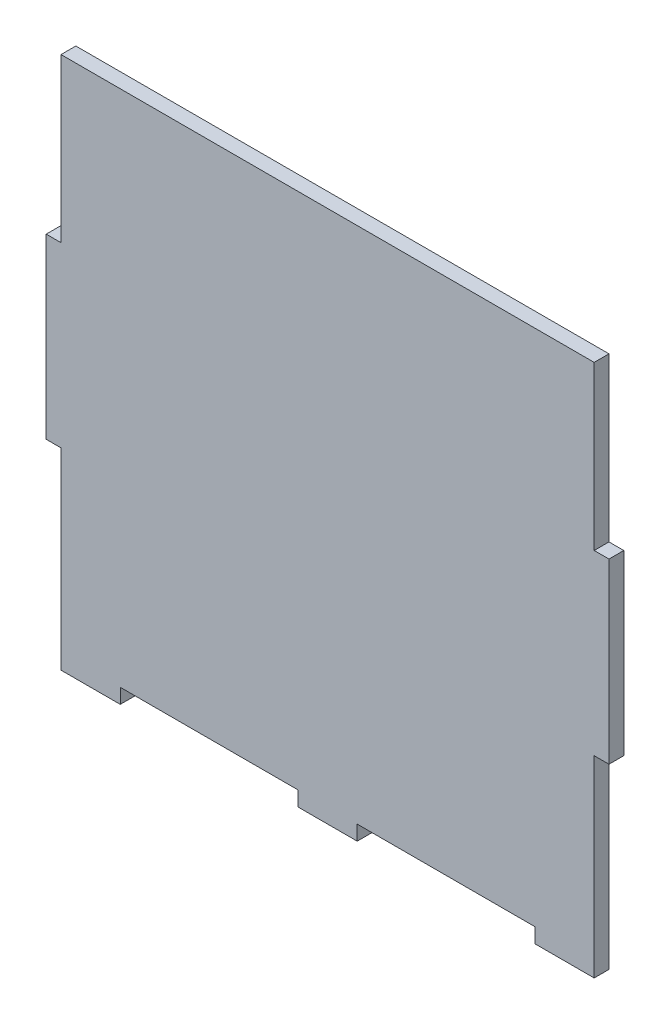
ISO-10303-21;
HEADER;
FILE_DESCRIPTION(('STEP AP214'),'2;1');
FILE_NAME('part.step','',(''),(''),'','','');
FILE_SCHEMA(('AUTOMOTIVE_DESIGN { 1 0 10303 214 1 1 1 1 }'));
ENDSEC;
DATA;
#1=APPLICATION_CONTEXT('core data for automotive mechanical design processes');
#2=APPLICATION_PROTOCOL_DEFINITION('international standard','automotive_design',2000,#1);
#3=PRODUCT_CONTEXT('',#1,'mechanical');
#4=PRODUCT('Part','Part','',(#3));
#5=PRODUCT_RELATED_PRODUCT_CATEGORY('part','',(#4));
#6=PRODUCT_DEFINITION_FORMATION('','',#4);
#7=PRODUCT_DEFINITION_CONTEXT('part definition',#1,'design');
#8=PRODUCT_DEFINITION('design','',#6,#7);
#9=PRODUCT_DEFINITION_SHAPE('','',#8);
#10=(LENGTH_UNIT() NAMED_UNIT(*) SI_UNIT(.MILLI.,.METRE.));
#11=(NAMED_UNIT(*) PLANE_ANGLE_UNIT() SI_UNIT($,.RADIAN.));
#12=(NAMED_UNIT(*) SI_UNIT($,.STERADIAN.) SOLID_ANGLE_UNIT());
#13=UNCERTAINTY_MEASURE_WITH_UNIT(LENGTH_MEASURE(1.E-05),#10,'distance_accuracy_value','');
#14=(GEOMETRIC_REPRESENTATION_CONTEXT(3) GLOBAL_UNCERTAINTY_ASSIGNED_CONTEXT((#13)) GLOBAL_UNIT_ASSIGNED_CONTEXT((#10,
#11,#12)) REPRESENTATION_CONTEXT('',''));
#15=CARTESIAN_POINT('',(0.,0.,0.));
#16=DIRECTION('',(0.,0.,1.));
#17=DIRECTION('',(1.,0.,0.));
#18=AXIS2_PLACEMENT_3D('',#15,#16,#17);
#19=CARTESIAN_POINT('',(-2.52340689555522E-13,-48.6157683545223,6.35));
#20=DIRECTION('',(0.,-1.,0.));
#21=DIRECTION('',(1.,0.,0.));
#22=AXIS2_PLACEMENT_3D('',#19,#20,#21);
#23=PLANE('',#22);
#24=DIRECTION('',(-1.,0.,0.));
#25=VECTOR('',#24,1.);
#26=CARTESIAN_POINT('',(-2.52340689555522E-13,-48.6157683545223,0.));
#27=LINE('',#26,#25);
#28=CARTESIAN_POINT('',(119.54433308199,-48.615768354523,0.));
#29=VERTEX_POINT('',#28);
#30=CARTESIAN_POINT('',(94.1443330819899,-48.6157683545228,0.));
#31=VERTEX_POINT('',#30);
#32=EDGE_CURVE('E201',#29,#31,#27,.T.);
#33=ORIENTED_EDGE('',*,*,#32,.F.);
#34=DIRECTION('',(0.,0.,-1.));
#35=VECTOR('',#34,1.);
#36=CARTESIAN_POINT('',(119.54433308199,-48.615768354523,6.35));
#37=LINE('',#36,#35);
#38=CARTESIAN_POINT('',(119.54433308199,-48.615768354523,6.35));
#39=VERTEX_POINT('',#38);
#40=EDGE_CURVE('E11',#39,#29,#37,.T.);
#41=ORIENTED_EDGE('',*,*,#40,.F.);
#42=DIRECTION('',(-1.,0.,0.));
#43=VECTOR('',#42,1.);
#44=CARTESIAN_POINT('',(-2.52340689555522E-13,-48.6157683545223,6.35));
#45=LINE('',#44,#43);
#46=CARTESIAN_POINT('',(94.1443330819899,-48.6157683545228,6.35));
#47=VERTEX_POINT('',#46);
#48=EDGE_CURVE('E248',#39,#47,#45,.T.);
#49=ORIENTED_EDGE('',*,*,#48,.T.);
#50=DIRECTION('',(0.,0.,-1.));
#51=VECTOR('',#50,1.);
#52=CARTESIAN_POINT('',(94.1443330819899,-48.6157683545228,6.35));
#53=LINE('',#52,#51);
#54=EDGE_CURVE('E51',#47,#31,#53,.T.);
#55=ORIENTED_EDGE('',*,*,#54,.T.);
#56=EDGE_LOOP('',(#33,#41,#49,#55));
#57=FACE_BOUND('',#56,.T.);
#58=ADVANCED_FACE('F35',(#57),#23,.T.);
#59=CARTESIAN_POINT('',(119.54433308199,0.,6.35));
#60=DIRECTION('',(1.,0.,0.));
#61=DIRECTION('',(0.,0.,-1.));
#62=AXIS2_PLACEMENT_3D('',#59,#60,#61);
#63=PLANE('',#62);
#64=DIRECTION('',(0.,-1.,0.));
#65=VECTOR('',#64,1.);
#66=CARTESIAN_POINT('',(119.54433308199,0.,0.));
#67=LINE('',#66,#65);
#68=CARTESIAN_POINT('',(119.54433308199,33.934231645477,0.));
#69=VERTEX_POINT('',#68);
#70=EDGE_CURVE('E203',#69,#29,#67,.T.);
#71=ORIENTED_EDGE('',*,*,#70,.F.);
#72=DIRECTION('',(0.,0.,-1.));
#73=VECTOR('',#72,1.);
#74=CARTESIAN_POINT('',(119.54433308199,33.934231645477,6.35));
#75=LINE('',#74,#73);
#76=CARTESIAN_POINT('',(119.54433308199,33.934231645477,6.35));
#77=VERTEX_POINT('',#76);
#78=EDGE_CURVE('E43',#77,#69,#75,.T.);
#79=ORIENTED_EDGE('',*,*,#78,.F.);
#80=DIRECTION('',(0.,-1.,0.));
#81=VECTOR('',#80,1.);
#82=CARTESIAN_POINT('',(119.54433308199,0.,6.35));
#83=LINE('',#82,#81);
#84=EDGE_CURVE('E306',#77,#39,#83,.T.);
#85=ORIENTED_EDGE('',*,*,#84,.T.);
#86=ORIENTED_EDGE('',*,*,#40,.T.);
#87=EDGE_LOOP('',(#71,#79,#85,#86));
#88=FACE_BOUND('',#87,.T.);
#89=ADVANCED_FACE('F294',(#88),#63,.T.);
#90=CARTESIAN_POINT('',(0.,33.934231645477,6.35));
#91=DIRECTION('',(0.,-1.,0.));
#92=DIRECTION('',(0.,0.,-1.));
#93=AXIS2_PLACEMENT_3D('',#90,#91,#92);
#94=PLANE('',#93);
#95=DIRECTION('',(-1.,0.,0.));
#96=VECTOR('',#95,1.);
#97=CARTESIAN_POINT('',(0.,33.934231645477,0.));
#98=LINE('',#97,#96);
#99=CARTESIAN_POINT('',(125.89433308199,33.934231645477,0.));
#100=VERTEX_POINT('',#99);
#101=EDGE_CURVE('E206',#100,#69,#98,.T.);
#102=ORIENTED_EDGE('',*,*,#101,.F.);
#103=DIRECTION('',(0.,0.,-1.));
#104=VECTOR('',#103,1.);
#105=CARTESIAN_POINT('',(125.89433308199,33.934231645477,6.35));
#106=LINE('',#105,#104);
#107=CARTESIAN_POINT('',(125.89433308199,33.934231645477,6.35));
#108=VERTEX_POINT('',#107);
#109=EDGE_CURVE('E283',#108,#100,#106,.T.);
#110=ORIENTED_EDGE('',*,*,#109,.F.);
#111=DIRECTION('',(-1.,0.,0.));
#112=VECTOR('',#111,1.);
#113=CARTESIAN_POINT('',(0.,33.934231645477,6.35));
#114=LINE('',#113,#112);
#115=EDGE_CURVE('E290',#108,#77,#114,.T.);
#116=ORIENTED_EDGE('',*,*,#115,.T.);
#117=ORIENTED_EDGE('',*,*,#78,.T.);
#118=EDGE_LOOP('',(#102,#110,#116,#117));
#119=FACE_BOUND('',#118,.T.);
#120=ADVANCED_FACE('F288',(#119),#94,.T.);
#121=CARTESIAN_POINT('',(125.89433308199,0.,6.35));
#122=DIRECTION('',(1.,0.,0.));
#123=DIRECTION('',(0.,0.,-1.));
#124=AXIS2_PLACEMENT_3D('',#121,#122,#123);
#125=PLANE('',#124);
#126=DIRECTION('',(0.,-1.,0.));
#127=VECTOR('',#126,1.);
#128=CARTESIAN_POINT('',(125.89433308199,0.,0.));
#129=LINE('',#128,#127);
#130=CARTESIAN_POINT('',(125.89433308199,110.134231645477,0.));
#131=VERTEX_POINT('',#130);
#132=EDGE_CURVE('E210',#131,#100,#129,.T.);
#133=ORIENTED_EDGE('',*,*,#132,.F.);
#134=DIRECTION('',(0.,0.,-1.));
#135=VECTOR('',#134,1.);
#136=CARTESIAN_POINT('',(125.89433308199,110.134231645477,6.35));
#137=LINE('',#136,#135);
#138=CARTESIAN_POINT('',(125.89433308199,110.134231645477,6.35));
#139=VERTEX_POINT('',#138);
#140=EDGE_CURVE('E281',#139,#131,#137,.T.);
#141=ORIENTED_EDGE('',*,*,#140,.F.);
#142=DIRECTION('',(0.,-1.,0.));
#143=VECTOR('',#142,1.);
#144=CARTESIAN_POINT('',(125.89433308199,0.,6.35));
#145=LINE('',#144,#143);
#146=EDGE_CURVE('E305',#139,#108,#145,.T.);
#147=ORIENTED_EDGE('',*,*,#146,.T.);
#148=ORIENTED_EDGE('',*,*,#109,.T.);
#149=EDGE_LOOP('',(#133,#141,#147,#148));
#150=FACE_BOUND('',#149,.T.);
#151=ADVANCED_FACE('F301',(#150),#125,.T.);
#152=CARTESIAN_POINT('',(-2.40695983803563E-13,110.134231645477,6.35));
#153=DIRECTION('',(0.,-1.,0.));
#154=DIRECTION('',(1.,0.,0.));
#155=AXIS2_PLACEMENT_3D('',#152,#153,#154);
#156=PLANE('',#155);
#157=DIRECTION('',(-1.,0.,0.));
#158=VECTOR('',#157,1.);
#159=CARTESIAN_POINT('',(-2.40695983803563E-13,110.134231645477,0.));
#160=LINE('',#159,#158);
#161=CARTESIAN_POINT('',(119.54433308199,110.134231645477,0.));
#162=VERTEX_POINT('',#161);
#163=EDGE_CURVE('E213',#131,#162,#160,.T.);
#164=ORIENTED_EDGE('',*,*,#163,.T.);
#165=DIRECTION('',(0.,0.,-1.));
#166=VECTOR('',#165,1.);
#167=CARTESIAN_POINT('',(119.54433308199,110.134231645477,6.35));
#168=LINE('',#167,#166);
#169=CARTESIAN_POINT('',(119.54433308199,110.134231645477,6.35));
#170=VERTEX_POINT('',#169);
#171=EDGE_CURVE('E279',#170,#162,#168,.T.);
#172=ORIENTED_EDGE('',*,*,#171,.F.);
#173=DIRECTION('',(-1.,0.,0.));
#174=VECTOR('',#173,1.);
#175=CARTESIAN_POINT('',(-2.40695983803563E-13,110.134231645477,6.35));
#176=LINE('',#175,#174);
#177=EDGE_CURVE('E308',#139,#170,#176,.T.);
#178=ORIENTED_EDGE('',*,*,#177,.F.);
#179=ORIENTED_EDGE('',*,*,#140,.T.);
#180=EDGE_LOOP('',(#164,#172,#178,#179));
#181=FACE_BOUND('',#180,.T.);
#182=ADVANCED_FACE('F507',(#181),#156,.F.);
#183=CARTESIAN_POINT('',(119.54433308199,179.984231645477,0.));
#184=VERTEX_POINT('',#183);
#185=EDGE_CURVE('E207',#184,#162,#67,.T.);
#186=ORIENTED_EDGE('',*,*,#185,.F.);
#187=DIRECTION('',(0.,0.,-1.));
#188=VECTOR('',#187,1.);
#189=CARTESIAN_POINT('',(119.54433308199,179.984231645477,6.35));
#190=LINE('',#189,#188);
#191=CARTESIAN_POINT('',(119.54433308199,179.984231645477,6.35));
#192=VERTEX_POINT('',#191);
#193=EDGE_CURVE('E277',#192,#184,#190,.T.);
#194=ORIENTED_EDGE('',*,*,#193,.F.);
#195=EDGE_CURVE('E311',#192,#170,#83,.T.);
#196=ORIENTED_EDGE('',*,*,#195,.T.);
#197=ORIENTED_EDGE('',*,*,#171,.T.);
#198=EDGE_LOOP('',(#186,#194,#196,#197));
#199=FACE_BOUND('',#198,.T.);
#200=ADVANCED_FACE('F363',(#199),#63,.T.);
#201=CARTESIAN_POINT('',(0.,179.984231645477,6.35));
#202=DIRECTION('',(0.,1.,0.));
#203=DIRECTION('',(0.,0.,1.));
#204=AXIS2_PLACEMENT_3D('',#201,#202,#203);
#205=PLANE('',#204);
#206=DIRECTION('',(1.,0.,0.));
#207=VECTOR('',#206,1.);
#208=CARTESIAN_POINT('',(0.,179.984231645477,0.));
#209=LINE('',#208,#207);
#210=CARTESIAN_POINT('',(-109.05566691801,179.984231645477,0.));
#211=VERTEX_POINT('',#210);
#212=EDGE_CURVE('E216',#211,#184,#209,.T.);
#213=ORIENTED_EDGE('',*,*,#212,.F.);
#214=DIRECTION('',(0.,0.,-1.));
#215=VECTOR('',#214,1.);
#216=CARTESIAN_POINT('',(-109.05566691801,179.984231645477,6.35));
#217=LINE('',#216,#215);
#218=CARTESIAN_POINT('',(-109.05566691801,179.984231645477,6.35));
#219=VERTEX_POINT('',#218);
#220=EDGE_CURVE('E275',#219,#211,#217,.T.);
#221=ORIENTED_EDGE('',*,*,#220,.F.);
#222=DIRECTION('',(1.,0.,0.));
#223=VECTOR('',#222,1.);
#224=CARTESIAN_POINT('',(0.,179.984231645477,6.35));
#225=LINE('',#224,#223);
#226=EDGE_CURVE('E315',#219,#192,#225,.T.);
#227=ORIENTED_EDGE('',*,*,#226,.T.);
#228=ORIENTED_EDGE('',*,*,#193,.T.);
#229=EDGE_LOOP('',(#213,#221,#227,#228));
#230=FACE_BOUND('',#229,.T.);
#231=ADVANCED_FACE('F489',(#230),#205,.T.);
#232=CARTESIAN_POINT('',(-109.05566691801,0.,6.35));
#233=DIRECTION('',(1.,0.,0.));
#234=DIRECTION('',(0.,0.,-1.));
#235=AXIS2_PLACEMENT_3D('',#232,#233,#234);
#236=PLANE('',#235);
#237=DIRECTION('',(0.,-1.,0.));
#238=VECTOR('',#237,1.);
#239=CARTESIAN_POINT('',(-109.05566691801,0.,0.));
#240=LINE('',#239,#238);
#241=CARTESIAN_POINT('',(-109.05566691801,110.134231645477,0.));
#242=VERTEX_POINT('',#241);
#243=EDGE_CURVE('E219',#211,#242,#240,.T.);
#244=ORIENTED_EDGE('',*,*,#243,.T.);
#245=DIRECTION('',(0.,0.,-1.));
#246=VECTOR('',#245,1.);
#247=CARTESIAN_POINT('',(-109.05566691801,110.134231645477,6.35));
#248=LINE('',#247,#246);
#249=CARTESIAN_POINT('',(-109.05566691801,110.134231645477,6.35));
#250=VERTEX_POINT('',#249);
#251=EDGE_CURVE('E273',#250,#242,#248,.T.);
#252=ORIENTED_EDGE('',*,*,#251,.F.);
#253=DIRECTION('',(0.,-1.,0.));
#254=VECTOR('',#253,1.);
#255=CARTESIAN_POINT('',(-109.05566691801,0.,6.35));
#256=LINE('',#255,#254);
#257=EDGE_CURVE('E318',#219,#250,#256,.T.);
#258=ORIENTED_EDGE('',*,*,#257,.F.);
#259=ORIENTED_EDGE('',*,*,#220,.T.);
#260=EDGE_LOOP('',(#244,#252,#258,#259));
#261=FACE_BOUND('',#260,.T.);
#262=ADVANCED_FACE('F452',(#261),#236,.F.);
#263=CARTESIAN_POINT('',(0.,110.134231645477,6.35));
#264=DIRECTION('',(0.,1.,0.));
#265=DIRECTION('',(0.,0.,1.));
#266=AXIS2_PLACEMENT_3D('',#263,#264,#265);
#267=PLANE('',#266);
#268=DIRECTION('',(1.,0.,0.));
#269=VECTOR('',#268,1.);
#270=CARTESIAN_POINT('',(0.,110.134231645477,0.));
#271=LINE('',#270,#269);
#272=CARTESIAN_POINT('',(-115.40566691801,110.134231645477,0.));
#273=VERTEX_POINT('',#272);
#274=EDGE_CURVE('E222',#273,#242,#271,.T.);
#275=ORIENTED_EDGE('',*,*,#274,.F.);
#276=DIRECTION('',(0.,0.,-1.));
#277=VECTOR('',#276,1.);
#278=CARTESIAN_POINT('',(-115.40566691801,110.134231645477,6.35));
#279=LINE('',#278,#277);
#280=CARTESIAN_POINT('',(-115.40566691801,110.134231645477,6.35));
#281=VERTEX_POINT('',#280);
#282=EDGE_CURVE('E271',#281,#273,#279,.T.);
#283=ORIENTED_EDGE('',*,*,#282,.F.);
#284=DIRECTION('',(1.,0.,0.));
#285=VECTOR('',#284,1.);
#286=CARTESIAN_POINT('',(0.,110.134231645477,6.35));
#287=LINE('',#286,#285);
#288=EDGE_CURVE('E320',#281,#250,#287,.T.);
#289=ORIENTED_EDGE('',*,*,#288,.T.);
#290=ORIENTED_EDGE('',*,*,#251,.T.);
#291=EDGE_LOOP('',(#275,#283,#289,#290));
#292=FACE_BOUND('',#291,.T.);
#293=ADVANCED_FACE('F470',(#292),#267,.T.);
#294=CARTESIAN_POINT('',(-115.40566691801,0.,6.35));
#295=DIRECTION('',(1.,0.,0.));
#296=DIRECTION('',(0.,0.,-1.));
#297=AXIS2_PLACEMENT_3D('',#294,#295,#296);
#298=PLANE('',#297);
#299=DIRECTION('',(0.,-1.,0.));
#300=VECTOR('',#299,1.);
#301=CARTESIAN_POINT('',(-115.40566691801,0.,0.));
#302=LINE('',#301,#300);
#303=CARTESIAN_POINT('',(-115.40566691801,33.934231645477,0.));
#304=VERTEX_POINT('',#303);
#305=EDGE_CURVE('E226',#273,#304,#302,.T.);
#306=ORIENTED_EDGE('',*,*,#305,.T.);
#307=DIRECTION('',(0.,0.,-1.));
#308=VECTOR('',#307,1.);
#309=CARTESIAN_POINT('',(-115.40566691801,33.934231645477,6.35));
#310=LINE('',#309,#308);
#311=CARTESIAN_POINT('',(-115.40566691801,33.934231645477,6.35));
#312=VERTEX_POINT('',#311);
#313=EDGE_CURVE('E268',#312,#304,#310,.T.);
#314=ORIENTED_EDGE('',*,*,#313,.F.);
#315=DIRECTION('',(0.,-1.,0.));
#316=VECTOR('',#315,1.);
#317=CARTESIAN_POINT('',(-115.40566691801,0.,6.35));
#318=LINE('',#317,#316);
#319=EDGE_CURVE('E324',#281,#312,#318,.T.);
#320=ORIENTED_EDGE('',*,*,#319,.F.);
#321=ORIENTED_EDGE('',*,*,#282,.T.);
#322=EDGE_LOOP('',(#306,#314,#320,#321));
#323=FACE_BOUND('',#322,.T.);
#324=ADVANCED_FACE('F460',(#323),#298,.F.);
#325=CARTESIAN_POINT('',(0.,33.934231645477,6.35));
#326=DIRECTION('',(0.,1.,0.));
#327=DIRECTION('',(0.,0.,1.));
#328=AXIS2_PLACEMENT_3D('',#325,#326,#327);
#329=PLANE('',#328);
#330=DIRECTION('',(1.,0.,0.));
#331=VECTOR('',#330,1.);
#332=CARTESIAN_POINT('',(0.,33.934231645477,0.));
#333=LINE('',#332,#331);
#334=CARTESIAN_POINT('',(-109.05566691801,33.934231645477,0.));
#335=VERTEX_POINT('',#334);
#336=EDGE_CURVE('E228',#304,#335,#333,.T.);
#337=ORIENTED_EDGE('',*,*,#336,.T.);
#338=DIRECTION('',(0.,0.,-1.));
#339=VECTOR('',#338,1.);
#340=CARTESIAN_POINT('',(-109.05566691801,33.934231645477,6.35));
#341=LINE('',#340,#339);
#342=CARTESIAN_POINT('',(-109.05566691801,33.934231645477,6.35));
#343=VERTEX_POINT('',#342);
#344=EDGE_CURVE('E265',#343,#335,#341,.T.);
#345=ORIENTED_EDGE('',*,*,#344,.F.);
#346=DIRECTION('',(1.,0.,0.));
#347=VECTOR('',#346,1.);
#348=CARTESIAN_POINT('',(0.,33.934231645477,6.35));
#349=LINE('',#348,#347);
#350=EDGE_CURVE('E326',#312,#343,#349,.T.);
#351=ORIENTED_EDGE('',*,*,#350,.F.);
#352=ORIENTED_EDGE('',*,*,#313,.T.);
#353=EDGE_LOOP('',(#337,#345,#351,#352));
#354=FACE_BOUND('',#353,.T.);
#355=ADVANCED_FACE('F449',(#354),#329,.F.);
#356=CARTESIAN_POINT('',(-109.05566691801,-48.615768354523,0.));
#357=VERTEX_POINT('',#356);
#358=EDGE_CURVE('E223',#335,#357,#240,.T.);
#359=ORIENTED_EDGE('',*,*,#358,.T.);
#360=DIRECTION('',(0.,0.,-1.));
#361=VECTOR('',#360,1.);
#362=CARTESIAN_POINT('',(-109.05566691801,-48.615768354523,6.35));
#363=LINE('',#362,#361);
#364=CARTESIAN_POINT('',(-109.05566691801,-48.615768354523,6.35));
#365=VERTEX_POINT('',#364);
#366=EDGE_CURVE('E262',#365,#357,#363,.T.);
#367=ORIENTED_EDGE('',*,*,#366,.F.);
#368=EDGE_CURVE('E321',#343,#365,#256,.T.);
#369=ORIENTED_EDGE('',*,*,#368,.F.);
#370=ORIENTED_EDGE('',*,*,#344,.T.);
#371=EDGE_LOOP('',(#359,#367,#369,#370));
#372=FACE_BOUND('',#371,.T.);
#373=ADVANCED_FACE('F439',(#372),#236,.F.);
#374=CARTESIAN_POINT('',(0.,-48.615768354523,6.35));
#375=DIRECTION('',(0.,1.,0.));
#376=DIRECTION('',(0.,0.,1.));
#377=AXIS2_PLACEMENT_3D('',#374,#375,#376);
#378=PLANE('',#377);
#379=DIRECTION('',(1.,0.,0.));
#380=VECTOR('',#379,1.);
#381=CARTESIAN_POINT('',(0.,-48.615768354523,0.));
#382=LINE('',#381,#380);
#383=CARTESIAN_POINT('',(-83.6556669180101,-48.615768354523,0.));
#384=VERTEX_POINT('',#383);
#385=EDGE_CURVE('E230',#357,#384,#382,.T.);
#386=ORIENTED_EDGE('',*,*,#385,.T.);
#387=DIRECTION('',(0.,0.,-1.));
#388=VECTOR('',#387,1.);
#389=CARTESIAN_POINT('',(-83.6556669180101,-48.615768354523,6.35));
#390=LINE('',#389,#388);
#391=CARTESIAN_POINT('',(-83.6556669180101,-48.615768354523,6.35));
#392=VERTEX_POINT('',#391);
#393=EDGE_CURVE('E259',#392,#384,#390,.T.);
#394=ORIENTED_EDGE('',*,*,#393,.F.);
#395=DIRECTION('',(1.,0.,0.));
#396=VECTOR('',#395,1.);
#397=CARTESIAN_POINT('',(0.,-48.615768354523,6.35));
#398=LINE('',#397,#396);
#399=EDGE_CURVE('E328',#365,#392,#398,.T.);
#400=ORIENTED_EDGE('',*,*,#399,.F.);
#401=ORIENTED_EDGE('',*,*,#366,.T.);
#402=EDGE_LOOP('',(#386,#394,#400,#401));
#403=FACE_BOUND('',#402,.T.);
#404=ADVANCED_FACE('F429',(#403),#378,.F.);
#405=CARTESIAN_POINT('',(-83.6556669180101,0.,6.35));
#406=DIRECTION('',(-1.,0.,0.));
#407=DIRECTION('',(0.,0.,1.));
#408=AXIS2_PLACEMENT_3D('',#405,#406,#407);
#409=PLANE('',#408);
#410=DIRECTION('',(0.,1.,0.));
#411=VECTOR('',#410,1.);
#412=CARTESIAN_POINT('',(-83.6556669180101,0.,0.));
#413=LINE('',#412,#411);
#414=CARTESIAN_POINT('',(-83.6556669180101,-42.2657683545231,0.));
#415=VERTEX_POINT('',#414);
#416=EDGE_CURVE('E232',#384,#415,#413,.T.);
#417=ORIENTED_EDGE('',*,*,#416,.T.);
#418=DIRECTION('',(0.,0.,-1.));
#419=VECTOR('',#418,1.);
#420=CARTESIAN_POINT('',(-83.6556669180101,-42.2657683545231,6.35));
#421=LINE('',#420,#419);
#422=CARTESIAN_POINT('',(-83.6556669180101,-42.2657683545231,6.35));
#423=VERTEX_POINT('',#422);
#424=EDGE_CURVE('E256',#423,#415,#421,.T.);
#425=ORIENTED_EDGE('',*,*,#424,.F.);
#426=DIRECTION('',(0.,1.,0.));
#427=VECTOR('',#426,1.);
#428=CARTESIAN_POINT('',(-83.6556669180101,0.,6.35));
#429=LINE('',#428,#427);
#430=EDGE_CURVE('E330',#392,#423,#429,.T.);
#431=ORIENTED_EDGE('',*,*,#430,.F.);
#432=ORIENTED_EDGE('',*,*,#393,.T.);
#433=EDGE_LOOP('',(#417,#425,#431,#432));
#434=FACE_BOUND('',#433,.T.);
#435=ADVANCED_FACE('F420',(#434),#409,.F.);
#436=CARTESIAN_POINT('',(0.,-42.2657683545229,6.35));
#437=DIRECTION('',(0.,1.,0.));
#438=DIRECTION('',(-1.,0.,0.));
#439=AXIS2_PLACEMENT_3D('',#436,#437,#438);
#440=PLANE('',#439);
#441=DIRECTION('',(1.,0.,0.));
#442=VECTOR('',#441,1.);
#443=CARTESIAN_POINT('',(0.,-42.2657683545229,0.));
#444=LINE('',#443,#442);
#445=CARTESIAN_POINT('',(-7.45566691801011,-42.2657683545229,0.));
#446=VERTEX_POINT('',#445);
#447=EDGE_CURVE('E234',#415,#446,#444,.T.);
#448=ORIENTED_EDGE('',*,*,#447,.T.);
#449=DIRECTION('',(0.,0.,-1.));
#450=VECTOR('',#449,1.);
#451=CARTESIAN_POINT('',(-7.45566691801011,-42.2657683545229,6.35));
#452=LINE('',#451,#450);
#453=CARTESIAN_POINT('',(-7.45566691801011,-42.2657683545229,6.35));
#454=VERTEX_POINT('',#453);
#455=EDGE_CURVE('E254',#454,#446,#452,.T.);
#456=ORIENTED_EDGE('',*,*,#455,.F.);
#457=DIRECTION('',(1.,0.,0.));
#458=VECTOR('',#457,1.);
#459=CARTESIAN_POINT('',(0.,-42.2657683545229,6.35));
#460=LINE('',#459,#458);
#461=EDGE_CURVE('E332',#423,#454,#460,.T.);
#462=ORIENTED_EDGE('',*,*,#461,.F.);
#463=ORIENTED_EDGE('',*,*,#424,.T.);
#464=EDGE_LOOP('',(#448,#456,#462,#463));
#465=FACE_BOUND('',#464,.T.);
#466=ADVANCED_FACE('F344',(#465),#440,.F.);
#467=CARTESIAN_POINT('',(-7.45566691801013,0.,6.35));
#468=DIRECTION('',(-1.,0.,0.));
#469=DIRECTION('',(0.,-1.,0.));
#470=AXIS2_PLACEMENT_3D('',#467,#468,#469);
#471=PLANE('',#470);
#472=DIRECTION('',(0.,1.,0.));
#473=VECTOR('',#472,1.);
#474=CARTESIAN_POINT('',(-7.45566691801013,0.,0.));
#475=LINE('',#474,#473);
#476=CARTESIAN_POINT('',(-7.45566691801011,-48.615768354523,0.));
#477=VERTEX_POINT('',#476);
#478=EDGE_CURVE('E237',#477,#446,#475,.T.);
#479=ORIENTED_EDGE('',*,*,#478,.F.);
#480=DIRECTION('',(0.,0.,-1.));
#481=VECTOR('',#480,1.);
#482=CARTESIAN_POINT('',(-7.45566691801011,-48.615768354523,6.35));
#483=LINE('',#482,#481);
#484=CARTESIAN_POINT('',(-7.45566691801011,-48.615768354523,6.35));
#485=VERTEX_POINT('',#484);
#486=EDGE_CURVE('E252',#485,#477,#483,.T.);
#487=ORIENTED_EDGE('',*,*,#486,.F.);
#488=DIRECTION('',(0.,1.,0.));
#489=VECTOR('',#488,1.);
#490=CARTESIAN_POINT('',(-7.45566691801013,0.,6.35));
#491=LINE('',#490,#489);
#492=EDGE_CURVE('E334',#485,#454,#491,.T.);
#493=ORIENTED_EDGE('',*,*,#492,.T.);
#494=ORIENTED_EDGE('',*,*,#455,.T.);
#495=EDGE_LOOP('',(#479,#487,#493,#494));
#496=FACE_BOUND('',#495,.T.);
#497=ADVANCED_FACE('F338',(#496),#471,.T.);
#498=CARTESIAN_POINT('',(0.,-48.615768354523,6.35));
#499=DIRECTION('',(0.,1.,0.));
#500=DIRECTION('',(-1.,0.,0.));
#501=AXIS2_PLACEMENT_3D('',#498,#499,#500);
#502=PLANE('',#501);
#503=DIRECTION('',(1.,0.,0.));
#504=VECTOR('',#503,1.);
#505=CARTESIAN_POINT('',(0.,-48.615768354523,0.));
#506=LINE('',#505,#504);
#507=CARTESIAN_POINT('',(17.9443330819899,-48.6157683545229,0.));
#508=VERTEX_POINT('',#507);
#509=EDGE_CURVE('E240',#477,#508,#506,.T.);
#510=ORIENTED_EDGE('',*,*,#509,.T.);
#511=DIRECTION('',(0.,0.,-1.));
#512=VECTOR('',#511,1.);
#513=CARTESIAN_POINT('',(17.9443330819899,-48.6157683545229,6.35));
#514=LINE('',#513,#512);
#515=CARTESIAN_POINT('',(17.9443330819899,-48.6157683545229,6.35));
#516=VERTEX_POINT('',#515);
#517=EDGE_CURVE('E193',#516,#508,#514,.T.);
#518=ORIENTED_EDGE('',*,*,#517,.F.);
#519=DIRECTION('',(1.,0.,0.));
#520=VECTOR('',#519,1.);
#521=CARTESIAN_POINT('',(0.,-48.615768354523,6.35));
#522=LINE('',#521,#520);
#523=EDGE_CURVE('E181',#485,#516,#522,.T.);
#524=ORIENTED_EDGE('',*,*,#523,.F.);
#525=ORIENTED_EDGE('',*,*,#486,.T.);
#526=EDGE_LOOP('',(#510,#518,#524,#525));
#527=FACE_BOUND('',#526,.T.);
#528=ADVANCED_FACE('F349',(#527),#502,.F.);
#529=CARTESIAN_POINT('',(17.9443330819899,0.,6.35));
#530=DIRECTION('',(-1.,0.,0.));
#531=DIRECTION('',(0.,0.,1.));
#532=AXIS2_PLACEMENT_3D('',#529,#530,#531);
#533=PLANE('',#532);
#534=DIRECTION('',(0.,1.,0.));
#535=VECTOR('',#534,1.);
#536=CARTESIAN_POINT('',(17.9443330819899,0.,0.));
#537=LINE('',#536,#535);
#538=CARTESIAN_POINT('',(17.9443330819899,-42.2657683545229,0.));
#539=VERTEX_POINT('',#538);
#540=EDGE_CURVE('E190',#508,#539,#537,.T.);
#541=ORIENTED_EDGE('',*,*,#540,.T.);
#542=DIRECTION('',(0.,0.,-1.));
#543=VECTOR('',#542,1.);
#544=CARTESIAN_POINT('',(17.9443330819899,-42.2657683545229,6.35));
#545=LINE('',#544,#543);
#546=CARTESIAN_POINT('',(17.9443330819899,-42.2657683545229,6.35));
#547=VERTEX_POINT('',#546);
#548=EDGE_CURVE('E187',#547,#539,#545,.T.);
#549=ORIENTED_EDGE('',*,*,#548,.F.);
#550=DIRECTION('',(0.,1.,0.));
#551=VECTOR('',#550,1.);
#552=CARTESIAN_POINT('',(17.9443330819899,0.,6.35));
#553=LINE('',#552,#551);
#554=EDGE_CURVE('E173',#516,#547,#553,.T.);
#555=ORIENTED_EDGE('',*,*,#554,.F.);
#556=ORIENTED_EDGE('',*,*,#517,.T.);
#557=EDGE_LOOP('',(#541,#549,#555,#556));
#558=FACE_BOUND('',#557,.T.);
#559=ADVANCED_FACE('F188',(#558),#533,.F.);
#560=CARTESIAN_POINT('',(0.,-42.2657683545229,6.35));
#561=DIRECTION('',(0.,-1.,0.));
#562=DIRECTION('',(1.,0.,0.));
#563=AXIS2_PLACEMENT_3D('',#560,#561,#562);
#564=PLANE('',#563);
#565=DIRECTION('',(-1.,0.,0.));
#566=VECTOR('',#565,1.);
#567=CARTESIAN_POINT('',(0.,-42.2657683545229,0.));
#568=LINE('',#567,#566);
#569=CARTESIAN_POINT('',(94.1443330819899,-42.2657683545231,0.));
#570=VERTEX_POINT('',#569);
#571=EDGE_CURVE('E243',#570,#539,#568,.T.);
#572=ORIENTED_EDGE('',*,*,#571,.F.);
#573=DIRECTION('',(0.,0.,-1.));
#574=VECTOR('',#573,1.);
#575=CARTESIAN_POINT('',(94.1443330819899,-42.2657683545231,6.35));
#576=LINE('',#575,#574);
#577=CARTESIAN_POINT('',(94.1443330819899,-42.2657683545231,6.35));
#578=VERTEX_POINT('',#577);
#579=EDGE_CURVE('E112',#578,#570,#576,.T.);
#580=ORIENTED_EDGE('',*,*,#579,.F.);
#581=DIRECTION('',(-1.,0.,0.));
#582=VECTOR('',#581,1.);
#583=CARTESIAN_POINT('',(0.,-42.2657683545229,6.35));
#584=LINE('',#583,#582);
#585=EDGE_CURVE('E178',#578,#547,#584,.T.);
#586=ORIENTED_EDGE('',*,*,#585,.T.);
#587=ORIENTED_EDGE('',*,*,#548,.T.);
#588=EDGE_LOOP('',(#572,#580,#586,#587));
#589=FACE_BOUND('',#588,.T.);
#590=ADVANCED_FACE('F195',(#589),#564,.T.);
#591=CARTESIAN_POINT('',(94.1443330819899,0.,6.35));
#592=DIRECTION('',(-1.,0.,0.));
#593=DIRECTION('',(0.,0.,1.));
#594=AXIS2_PLACEMENT_3D('',#591,#592,#593);
#595=PLANE('',#594);
#596=DIRECTION('',(0.,1.,0.));
#597=VECTOR('',#596,1.);
#598=CARTESIAN_POINT('',(94.1443330819899,0.,0.));
#599=LINE('',#598,#597);
#600=EDGE_CURVE('E245',#31,#570,#599,.T.);
#601=ORIENTED_EDGE('',*,*,#600,.F.);
#602=ORIENTED_EDGE('',*,*,#54,.F.);
#603=DIRECTION('',(0.,1.,0.));
#604=VECTOR('',#603,1.);
#605=CARTESIAN_POINT('',(94.1443330819899,0.,6.35));
#606=LINE('',#605,#604);
#607=EDGE_CURVE('E196',#47,#578,#606,.T.);
#608=ORIENTED_EDGE('',*,*,#607,.T.);
#609=ORIENTED_EDGE('',*,*,#579,.T.);
#610=EDGE_LOOP('',(#601,#602,#608,#609));
#611=FACE_BOUND('',#610,.T.);
#612=ADVANCED_FACE('F364',(#611),#595,.T.);
#613=CARTESIAN_POINT('',(0.,0.,6.35));
#614=DIRECTION('',(0.,0.,1.));
#615=DIRECTION('',(1.,0.,0.));
#616=AXIS2_PLACEMENT_3D('',#613,#614,#615);
#617=PLANE('',#616);
#618=ORIENTED_EDGE('',*,*,#48,.F.);
#619=ORIENTED_EDGE('',*,*,#84,.F.);
#620=ORIENTED_EDGE('',*,*,#115,.F.);
#621=ORIENTED_EDGE('',*,*,#146,.F.);
#622=ORIENTED_EDGE('',*,*,#177,.T.);
#623=ORIENTED_EDGE('',*,*,#195,.F.);
#624=ORIENTED_EDGE('',*,*,#226,.F.);
#625=ORIENTED_EDGE('',*,*,#257,.T.);
#626=ORIENTED_EDGE('',*,*,#288,.F.);
#627=ORIENTED_EDGE('',*,*,#319,.T.);
#628=ORIENTED_EDGE('',*,*,#350,.T.);
#629=ORIENTED_EDGE('',*,*,#368,.T.);
#630=ORIENTED_EDGE('',*,*,#399,.T.);
#631=ORIENTED_EDGE('',*,*,#430,.T.);
#632=ORIENTED_EDGE('',*,*,#461,.T.);
#633=ORIENTED_EDGE('',*,*,#492,.F.);
#634=ORIENTED_EDGE('',*,*,#523,.T.);
#635=ORIENTED_EDGE('',*,*,#554,.T.);
#636=ORIENTED_EDGE('',*,*,#585,.F.);
#637=ORIENTED_EDGE('',*,*,#607,.F.);
#638=EDGE_LOOP('',(#618,#619,#620,#621,#622,#623,#624,#625,#626,#627,#628,#629,#630,#631,#632,
#633,#634,#635,#636,#637));
#639=FACE_BOUND('',#638,.T.);
#640=ADVANCED_FACE('F175',(#639),#617,.T.);
#641=CARTESIAN_POINT('',(0.,0.,0.));
#642=DIRECTION('',(0.,0.,1.));
#643=DIRECTION('',(1.,0.,0.));
#644=AXIS2_PLACEMENT_3D('',#641,#642,#643);
#645=PLANE('',#644);
#646=ORIENTED_EDGE('',*,*,#32,.T.);
#647=ORIENTED_EDGE('',*,*,#600,.T.);
#648=ORIENTED_EDGE('',*,*,#571,.T.);
#649=ORIENTED_EDGE('',*,*,#540,.F.);
#650=ORIENTED_EDGE('',*,*,#509,.F.);
#651=ORIENTED_EDGE('',*,*,#478,.T.);
#652=ORIENTED_EDGE('',*,*,#447,.F.);
#653=ORIENTED_EDGE('',*,*,#416,.F.);
#654=ORIENTED_EDGE('',*,*,#385,.F.);
#655=ORIENTED_EDGE('',*,*,#358,.F.);
#656=ORIENTED_EDGE('',*,*,#336,.F.);
#657=ORIENTED_EDGE('',*,*,#305,.F.);
#658=ORIENTED_EDGE('',*,*,#274,.T.);
#659=ORIENTED_EDGE('',*,*,#243,.F.);
#660=ORIENTED_EDGE('',*,*,#212,.T.);
#661=ORIENTED_EDGE('',*,*,#185,.T.);
#662=ORIENTED_EDGE('',*,*,#163,.F.);
#663=ORIENTED_EDGE('',*,*,#132,.T.);
#664=ORIENTED_EDGE('',*,*,#101,.T.);
#665=ORIENTED_EDGE('',*,*,#70,.T.);
#666=EDGE_LOOP('',(#646,#647,#648,#649,#650,#651,#652,#653,#654,#655,#656,#657,#658,#659,#660,
#661,#662,#663,#664,#665));
#667=FACE_BOUND('',#666,.T.);
#668=ADVANCED_FACE('F296',(#667),#645,.F.);
#669=CLOSED_SHELL('',(#58,#89,#120,#151,#182,#200,#231,#262,#293,#324,#355,#373,#404,#435,#466,
#497,#528,#559,#590,#612,#640,#668));
#670=MANIFOLD_SOLID_BREP('B2',#669);
#671=ADVANCED_BREP_SHAPE_REPRESENTATION('',(#18,#670),#14);
#672=SHAPE_DEFINITION_REPRESENTATION(#9,#671);
ENDSEC;
END-ISO-10303-21;
